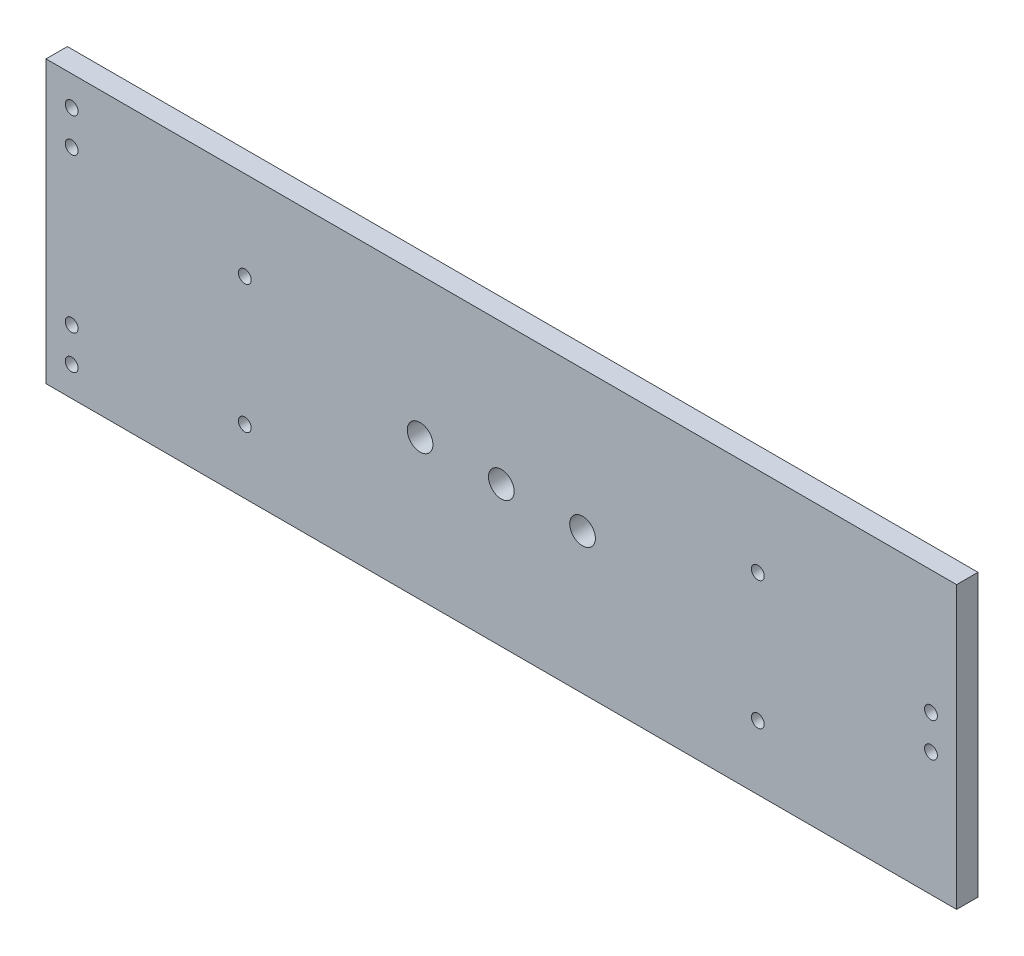
ISO-10303-21;
HEADER;
FILE_DESCRIPTION(('STEP AP214'),'2;1');
FILE_NAME('part.step','',(''),(''),'','','');
FILE_SCHEMA(('AUTOMOTIVE_DESIGN { 1 0 10303 214 1 1 1 1 }'));
ENDSEC;
DATA;
#1=APPLICATION_CONTEXT('core data for automotive mechanical design processes');
#2=APPLICATION_PROTOCOL_DEFINITION('international standard','automotive_design',2000,#1);
#3=PRODUCT_CONTEXT('',#1,'mechanical');
#4=PRODUCT('Part','Part','',(#3));
#5=PRODUCT_RELATED_PRODUCT_CATEGORY('part','',(#4));
#6=PRODUCT_DEFINITION_FORMATION('','',#4);
#7=PRODUCT_DEFINITION_CONTEXT('part definition',#1,'design');
#8=PRODUCT_DEFINITION('design','',#6,#7);
#9=PRODUCT_DEFINITION_SHAPE('','',#8);
#10=(LENGTH_UNIT() NAMED_UNIT(*) SI_UNIT(.MILLI.,.METRE.));
#11=(NAMED_UNIT(*) PLANE_ANGLE_UNIT() SI_UNIT($,.RADIAN.));
#12=(NAMED_UNIT(*) SI_UNIT($,.STERADIAN.) SOLID_ANGLE_UNIT());
#13=UNCERTAINTY_MEASURE_WITH_UNIT(LENGTH_MEASURE(1.E-05),#10,'distance_accuracy_value','');
#14=(GEOMETRIC_REPRESENTATION_CONTEXT(3) GLOBAL_UNCERTAINTY_ASSIGNED_CONTEXT((#13)) GLOBAL_UNIT_ASSIGNED_CONTEXT((#10,
#11,#12)) REPRESENTATION_CONTEXT('',''));
#15=CARTESIAN_POINT('',(0.,0.,0.));
#16=DIRECTION('',(0.,0.,1.));
#17=DIRECTION('',(1.,0.,0.));
#18=AXIS2_PLACEMENT_3D('',#15,#16,#17);
#19=CARTESIAN_POINT('',(0.,0.,5.));
#20=DIRECTION('',(0.,0.,1.));
#21=DIRECTION('',(1.,0.,0.));
#22=AXIS2_PLACEMENT_3D('',#19,#20,#21);
#23=PLANE('',#22);
#24=CARTESIAN_POINT('',(19.,0.,5.));
#25=DIRECTION('',(0.,0.,1.));
#26=DIRECTION('',(1.,0.,0.));
#27=AXIS2_PLACEMENT_3D('',#24,#25,#26);
#28=CIRCLE('',#27,3.);
#29=CARTESIAN_POINT('',(22.,0.,5.));
#30=VERTEX_POINT('',#29);
#31=EDGE_CURVE('E116',#30,#30,#28,.T.);
#32=ORIENTED_EDGE('',*,*,#31,.F.);
#33=EDGE_LOOP('',(#32));
#34=FACE_BOUND('',#33,.T.);
#35=CARTESIAN_POINT('',(-19.,0.,5.));
#36=DIRECTION('',(0.,0.,1.));
#37=DIRECTION('',(1.,0.,0.));
#38=AXIS2_PLACEMENT_3D('',#35,#36,#37);
#39=CIRCLE('',#38,3.);
#40=CARTESIAN_POINT('',(-16.,0.,5.));
#41=VERTEX_POINT('',#40);
#42=EDGE_CURVE('E122',#41,#41,#39,.T.);
#43=ORIENTED_EDGE('',*,*,#42,.F.);
#44=EDGE_LOOP('',(#43));
#45=FACE_BOUND('',#44,.T.);
#46=CARTESIAN_POINT('',(-100.5,26.,5.));
#47=DIRECTION('',(0.,0.,1.));
#48=DIRECTION('',(1.,0.,0.));
#49=AXIS2_PLACEMENT_3D('',#46,#47,#48);
#50=CIRCLE('',#49,1.5);
#51=CARTESIAN_POINT('',(-98.9999999999999,26.,5.));
#52=VERTEX_POINT('',#51);
#53=EDGE_CURVE('E133',#52,#52,#50,.T.);
#54=ORIENTED_EDGE('',*,*,#53,.F.);
#55=EDGE_LOOP('',(#54));
#56=FACE_BOUND('',#55,.T.);
#57=CARTESIAN_POINT('',(-100.5,18.,5.));
#58=DIRECTION('',(0.,0.,1.));
#59=DIRECTION('',(1.,0.,0.));
#60=AXIS2_PLACEMENT_3D('',#57,#58,#59);
#61=CIRCLE('',#60,1.5);
#62=CARTESIAN_POINT('',(-98.9999999999999,18.,5.));
#63=VERTEX_POINT('',#62);
#64=EDGE_CURVE('E139',#63,#63,#61,.T.);
#65=ORIENTED_EDGE('',*,*,#64,.F.);
#66=EDGE_LOOP('',(#65));
#67=FACE_BOUND('',#66,.T.);
#68=CARTESIAN_POINT('',(100.499999999999,-3.99999999999997,5.));
#69=DIRECTION('',(0.,0.,1.));
#70=DIRECTION('',(1.,0.,0.));
#71=AXIS2_PLACEMENT_3D('',#68,#69,#70);
#72=CIRCLE('',#71,1.5);
#73=CARTESIAN_POINT('',(101.999999999999,-3.99999999999997,5.));
#74=VERTEX_POINT('',#73);
#75=EDGE_CURVE('E151',#74,#74,#72,.F.);
#76=ORIENTED_EDGE('',*,*,#75,.T.);
#77=EDGE_LOOP('',(#76));
#78=FACE_BOUND('',#77,.T.);
#79=CARTESIAN_POINT('',(-100.499999999999,-18.,5.));
#80=DIRECTION('',(0.,0.,1.));
#81=DIRECTION('',(1.,0.,0.));
#82=AXIS2_PLACEMENT_3D('',#79,#80,#81);
#83=CIRCLE('',#82,1.5);
#84=CARTESIAN_POINT('',(-98.9999999999995,-18.,5.));
#85=VERTEX_POINT('',#84);
#86=EDGE_CURVE('E157',#85,#85,#83,.T.);
#87=ORIENTED_EDGE('',*,*,#86,.F.);
#88=EDGE_LOOP('',(#87));
#89=FACE_BOUND('',#88,.T.);
#90=CARTESIAN_POINT('',(-100.499999999999,-26.,5.));
#91=DIRECTION('',(0.,0.,1.));
#92=DIRECTION('',(1.,0.,0.));
#93=AXIS2_PLACEMENT_3D('',#90,#91,#92);
#94=CIRCLE('',#93,1.5);
#95=CARTESIAN_POINT('',(-98.9999999999995,-26.,5.));
#96=VERTEX_POINT('',#95);
#97=EDGE_CURVE('E120',#96,#96,#94,.T.);
#98=ORIENTED_EDGE('',*,*,#97,.F.);
#99=EDGE_LOOP('',(#98));
#100=FACE_BOUND('',#99,.T.);
#101=CARTESIAN_POINT('',(-60.,12.1,5.));
#102=DIRECTION('',(0.,0.,1.));
#103=DIRECTION('',(-1.,0.,0.));
#104=AXIS2_PLACEMENT_3D('',#101,#102,#103);
#105=CIRCLE('',#104,1.5);
#106=CARTESIAN_POINT('',(-61.5,12.1,5.));
#107=VERTEX_POINT('',#106);
#108=EDGE_CURVE('E178',#107,#107,#105,.T.);
#109=ORIENTED_EDGE('',*,*,#108,.F.);
#110=EDGE_LOOP('',(#109));
#111=FACE_BOUND('',#110,.T.);
#112=CARTESIAN_POINT('',(-60.,-17.9,5.));
#113=DIRECTION('',(0.,0.,1.));
#114=DIRECTION('',(-1.,0.,0.));
#115=AXIS2_PLACEMENT_3D('',#112,#113,#114);
#116=CIRCLE('',#115,1.5);
#117=CARTESIAN_POINT('',(-61.5,-17.9,5.));
#118=VERTEX_POINT('',#117);
#119=EDGE_CURVE('E172',#118,#118,#116,.T.);
#120=ORIENTED_EDGE('',*,*,#119,.F.);
#121=EDGE_LOOP('',(#120));
#122=FACE_BOUND('',#121,.T.);
#123=CARTESIAN_POINT('',(60.,-17.9,5.));
#124=DIRECTION('',(0.,0.,1.));
#125=DIRECTION('',(1.,0.,0.));
#126=AXIS2_PLACEMENT_3D('',#123,#124,#125);
#127=CIRCLE('',#126,1.5);
#128=CARTESIAN_POINT('',(61.5,-17.9,5.));
#129=VERTEX_POINT('',#128);
#130=EDGE_CURVE('E165',#129,#129,#127,.T.);
#131=ORIENTED_EDGE('',*,*,#130,.F.);
#132=EDGE_LOOP('',(#131));
#133=FACE_BOUND('',#132,.T.);
#134=CARTESIAN_POINT('',(60.,12.1,5.));
#135=DIRECTION('',(0.,0.,1.));
#136=DIRECTION('',(1.,0.,0.));
#137=AXIS2_PLACEMENT_3D('',#134,#135,#136);
#138=CIRCLE('',#137,1.5);
#139=CARTESIAN_POINT('',(61.5,12.1,5.));
#140=VERTEX_POINT('',#139);
#141=EDGE_CURVE('E168',#140,#140,#138,.T.);
#142=ORIENTED_EDGE('',*,*,#141,.F.);
#143=EDGE_LOOP('',(#142));
#144=FACE_BOUND('',#143,.T.);
#145=DIRECTION('',(0.,-1.,0.));
#146=VECTOR('',#145,1.);
#147=CARTESIAN_POINT('',(-106.5,-32.9,5.));
#148=LINE('',#147,#146);
#149=CARTESIAN_POINT('',(-106.5,32.9,5.));
#150=VERTEX_POINT('',#149);
#151=CARTESIAN_POINT('',(-106.5,-32.9,5.));
#152=VERTEX_POINT('',#151);
#153=EDGE_CURVE('E93',#150,#152,#148,.T.);
#154=ORIENTED_EDGE('',*,*,#153,.T.);
#155=DIRECTION('',(1.,0.,0.));
#156=VECTOR('',#155,1.);
#157=CARTESIAN_POINT('',(106.5,-32.9,5.));
#158=LINE('',#157,#156);
#159=CARTESIAN_POINT('',(106.5,-32.9,5.));
#160=VERTEX_POINT('',#159);
#161=EDGE_CURVE('E88',#152,#160,#158,.T.);
#162=ORIENTED_EDGE('',*,*,#161,.T.);
#163=DIRECTION('',(0.,1.,0.));
#164=VECTOR('',#163,1.);
#165=CARTESIAN_POINT('',(106.5,-32.9,5.));
#166=LINE('',#165,#164);
#167=CARTESIAN_POINT('',(106.5,32.9,5.));
#168=VERTEX_POINT('',#167);
#169=EDGE_CURVE('E91',#160,#168,#166,.T.);
#170=ORIENTED_EDGE('',*,*,#169,.T.);
#171=DIRECTION('',(-1.,0.,0.));
#172=VECTOR('',#171,1.);
#173=CARTESIAN_POINT('',(106.5,32.9,5.));
#174=LINE('',#173,#172);
#175=EDGE_CURVE('E58',#168,#150,#174,.T.);
#176=ORIENTED_EDGE('',*,*,#175,.T.);
#177=EDGE_LOOP('',(#154,#162,#170,#176));
#178=FACE_BOUND('',#177,.T.);
#179=CARTESIAN_POINT('',(0.,0.,5.));
#180=DIRECTION('',(0.,0.,1.));
#181=DIRECTION('',(1.,0.,0.));
#182=AXIS2_PLACEMENT_3D('',#179,#180,#181);
#183=CIRCLE('',#182,3.);
#184=CARTESIAN_POINT('',(2.99999999999997,0.,5.));
#185=VERTEX_POINT('',#184);
#186=EDGE_CURVE('E109',#185,#185,#183,.T.);
#187=ORIENTED_EDGE('',*,*,#186,.F.);
#188=EDGE_LOOP('',(#187));
#189=FACE_BOUND('',#188,.T.);
#190=CARTESIAN_POINT('',(100.499999999999,4.00000000000003,5.));
#191=DIRECTION('',(0.,0.,1.));
#192=DIRECTION('',(1.,0.,0.));
#193=AXIS2_PLACEMENT_3D('',#190,#191,#192);
#194=CIRCLE('',#193,1.5);
#195=CARTESIAN_POINT('',(101.999999999999,4.00000000000003,5.));
#196=VERTEX_POINT('',#195);
#197=EDGE_CURVE('E145',#196,#196,#194,.F.);
#198=ORIENTED_EDGE('',*,*,#197,.T.);
#199=EDGE_LOOP('',(#198));
#200=FACE_BOUND('',#199,.T.);
#201=ADVANCED_FACE('F39',(#34,#45,#56,#67,#78,#89,#100,#111,#122,#133,#144,#178,#189,#200),#23,.T.);
#202=CARTESIAN_POINT('',(0.,0.,0.));
#203=DIRECTION('',(0.,0.,1.));
#204=DIRECTION('',(1.,0.,0.));
#205=AXIS2_PLACEMENT_3D('',#202,#203,#204);
#206=PLANE('',#205);
#207=CARTESIAN_POINT('',(19.,0.,0.));
#208=DIRECTION('',(0.,0.,1.));
#209=DIRECTION('',(1.,0.,0.));
#210=AXIS2_PLACEMENT_3D('',#207,#208,#209);
#211=CIRCLE('',#210,3.);
#212=CARTESIAN_POINT('',(22.,0.,0.));
#213=VERTEX_POINT('',#212);
#214=EDGE_CURVE('E43',#213,#213,#211,.T.);
#215=ORIENTED_EDGE('',*,*,#214,.T.);
#216=EDGE_LOOP('',(#215));
#217=FACE_BOUND('',#216,.T.);
#218=CARTESIAN_POINT('',(-19.,0.,0.));
#219=DIRECTION('',(0.,0.,1.));
#220=DIRECTION('',(1.,0.,0.));
#221=AXIS2_PLACEMENT_3D('',#218,#219,#220);
#222=CIRCLE('',#221,3.);
#223=CARTESIAN_POINT('',(-16.,0.,0.));
#224=VERTEX_POINT('',#223);
#225=EDGE_CURVE('E114',#224,#224,#222,.T.);
#226=ORIENTED_EDGE('',*,*,#225,.T.);
#227=EDGE_LOOP('',(#226));
#228=FACE_BOUND('',#227,.T.);
#229=CARTESIAN_POINT('',(-100.5,26.,0.));
#230=DIRECTION('',(0.,0.,1.));
#231=DIRECTION('',(1.,0.,0.));
#232=AXIS2_PLACEMENT_3D('',#229,#230,#231);
#233=CIRCLE('',#232,1.5);
#234=CARTESIAN_POINT('',(-98.9999999999999,26.,0.));
#235=VERTEX_POINT('',#234);
#236=EDGE_CURVE('E129',#235,#235,#233,.T.);
#237=ORIENTED_EDGE('',*,*,#236,.T.);
#238=EDGE_LOOP('',(#237));
#239=FACE_BOUND('',#238,.T.);
#240=CARTESIAN_POINT('',(-100.5,18.,0.));
#241=DIRECTION('',(0.,0.,1.));
#242=DIRECTION('',(1.,0.,0.));
#243=AXIS2_PLACEMENT_3D('',#240,#241,#242);
#244=CIRCLE('',#243,1.5);
#245=CARTESIAN_POINT('',(-98.9999999999999,18.,0.));
#246=VERTEX_POINT('',#245);
#247=EDGE_CURVE('E136',#246,#246,#244,.T.);
#248=ORIENTED_EDGE('',*,*,#247,.T.);
#249=EDGE_LOOP('',(#248));
#250=FACE_BOUND('',#249,.T.);
#251=CARTESIAN_POINT('',(-100.499999999999,-18.,0.));
#252=DIRECTION('',(0.,0.,1.));
#253=DIRECTION('',(1.,0.,0.));
#254=AXIS2_PLACEMENT_3D('',#251,#252,#253);
#255=CIRCLE('',#254,1.5);
#256=CARTESIAN_POINT('',(-98.9999999999995,-18.,0.));
#257=VERTEX_POINT('',#256);
#258=EDGE_CURVE('E154',#257,#257,#255,.T.);
#259=ORIENTED_EDGE('',*,*,#258,.T.);
#260=EDGE_LOOP('',(#259));
#261=FACE_BOUND('',#260,.T.);
#262=CARTESIAN_POINT('',(-100.499999999999,-26.,0.));
#263=DIRECTION('',(0.,0.,1.));
#264=DIRECTION('',(1.,0.,0.));
#265=AXIS2_PLACEMENT_3D('',#262,#263,#264);
#266=CIRCLE('',#265,1.5);
#267=CARTESIAN_POINT('',(-98.9999999999995,-26.,0.));
#268=VERTEX_POINT('',#267);
#269=EDGE_CURVE('E160',#268,#268,#266,.T.);
#270=ORIENTED_EDGE('',*,*,#269,.T.);
#271=EDGE_LOOP('',(#270));
#272=FACE_BOUND('',#271,.T.);
#273=CARTESIAN_POINT('',(-60.,12.1,0.));
#274=DIRECTION('',(0.,0.,1.));
#275=DIRECTION('',(-1.,0.,0.));
#276=AXIS2_PLACEMENT_3D('',#273,#274,#275);
#277=CIRCLE('',#276,1.5);
#278=CARTESIAN_POINT('',(-61.5,12.1,0.));
#279=VERTEX_POINT('',#278);
#280=EDGE_CURVE('E132',#279,#279,#277,.T.);
#281=ORIENTED_EDGE('',*,*,#280,.T.);
#282=EDGE_LOOP('',(#281));
#283=FACE_BOUND('',#282,.T.);
#284=CARTESIAN_POINT('',(-60.,-17.9,0.));
#285=DIRECTION('',(0.,0.,1.));
#286=DIRECTION('',(-1.,0.,0.));
#287=AXIS2_PLACEMENT_3D('',#284,#285,#286);
#288=CIRCLE('',#287,1.5);
#289=CARTESIAN_POINT('',(-61.5,-17.9,0.));
#290=VERTEX_POINT('',#289);
#291=EDGE_CURVE('E175',#290,#290,#288,.T.);
#292=ORIENTED_EDGE('',*,*,#291,.T.);
#293=EDGE_LOOP('',(#292));
#294=FACE_BOUND('',#293,.T.);
#295=CARTESIAN_POINT('',(60.,-17.9,0.));
#296=DIRECTION('',(0.,0.,1.));
#297=DIRECTION('',(1.,0.,0.));
#298=AXIS2_PLACEMENT_3D('',#295,#296,#297);
#299=CIRCLE('',#298,1.5);
#300=CARTESIAN_POINT('',(61.5,-17.9,0.));
#301=VERTEX_POINT('',#300);
#302=EDGE_CURVE('E169',#301,#301,#299,.T.);
#303=ORIENTED_EDGE('',*,*,#302,.T.);
#304=EDGE_LOOP('',(#303));
#305=FACE_BOUND('',#304,.T.);
#306=CARTESIAN_POINT('',(60.,12.1,0.));
#307=DIRECTION('',(0.,0.,1.));
#308=DIRECTION('',(1.,0.,0.));
#309=AXIS2_PLACEMENT_3D('',#306,#307,#308);
#310=CIRCLE('',#309,1.5);
#311=CARTESIAN_POINT('',(61.5,12.1,0.));
#312=VERTEX_POINT('',#311);
#313=EDGE_CURVE('E183',#312,#312,#310,.T.);
#314=ORIENTED_EDGE('',*,*,#313,.T.);
#315=EDGE_LOOP('',(#314));
#316=FACE_BOUND('',#315,.T.);
#317=DIRECTION('',(0.,-1.,0.));
#318=VECTOR('',#317,1.);
#319=CARTESIAN_POINT('',(-106.5,-32.9,0.));
#320=LINE('',#319,#318);
#321=CARTESIAN_POINT('',(-106.5,32.9,0.));
#322=VERTEX_POINT('',#321);
#323=CARTESIAN_POINT('',(-106.5,-32.9,0.));
#324=VERTEX_POINT('',#323);
#325=EDGE_CURVE('E106',#322,#324,#320,.T.);
#326=ORIENTED_EDGE('',*,*,#325,.F.);
#327=DIRECTION('',(-1.,0.,0.));
#328=VECTOR('',#327,1.);
#329=CARTESIAN_POINT('',(106.5,32.9,0.));
#330=LINE('',#329,#328);
#331=CARTESIAN_POINT('',(106.5,32.9,0.));
#332=VERTEX_POINT('',#331);
#333=EDGE_CURVE('E81',#332,#322,#330,.T.);
#334=ORIENTED_EDGE('',*,*,#333,.F.);
#335=DIRECTION('',(0.,1.,0.));
#336=VECTOR('',#335,1.);
#337=CARTESIAN_POINT('',(106.5,-32.9,0.));
#338=LINE('',#337,#336);
#339=CARTESIAN_POINT('',(106.5,-32.9,0.));
#340=VERTEX_POINT('',#339);
#341=EDGE_CURVE('E75',#340,#332,#338,.T.);
#342=ORIENTED_EDGE('',*,*,#341,.F.);
#343=DIRECTION('',(1.,0.,0.));
#344=VECTOR('',#343,1.);
#345=CARTESIAN_POINT('',(106.5,-32.9,0.));
#346=LINE('',#345,#344);
#347=EDGE_CURVE('E97',#324,#340,#346,.T.);
#348=ORIENTED_EDGE('',*,*,#347,.F.);
#349=EDGE_LOOP('',(#326,#334,#342,#348));
#350=FACE_BOUND('',#349,.T.);
#351=CARTESIAN_POINT('',(0.,0.,0.));
#352=DIRECTION('',(0.,0.,1.));
#353=DIRECTION('',(1.,0.,0.));
#354=AXIS2_PLACEMENT_3D('',#351,#352,#353);
#355=CIRCLE('',#354,3.);
#356=CARTESIAN_POINT('',(2.99999999999997,0.,0.));
#357=VERTEX_POINT('',#356);
#358=EDGE_CURVE('E186',#357,#357,#355,.T.);
#359=ORIENTED_EDGE('',*,*,#358,.T.);
#360=EDGE_LOOP('',(#359));
#361=FACE_BOUND('',#360,.T.);
#362=CARTESIAN_POINT('',(100.499999999999,-3.99999999999997,0.));
#363=DIRECTION('',(0.,0.,1.));
#364=DIRECTION('',(1.,0.,0.));
#365=AXIS2_PLACEMENT_3D('',#362,#363,#364);
#366=CIRCLE('',#365,1.5);
#367=CARTESIAN_POINT('',(101.999999999999,-3.99999999999997,0.));
#368=VERTEX_POINT('',#367);
#369=EDGE_CURVE('E148',#368,#368,#366,.F.);
#370=ORIENTED_EDGE('',*,*,#369,.F.);
#371=EDGE_LOOP('',(#370));
#372=FACE_BOUND('',#371,.T.);
#373=CARTESIAN_POINT('',(100.499999999999,4.00000000000003,0.));
#374=DIRECTION('',(0.,0.,1.));
#375=DIRECTION('',(1.,0.,0.));
#376=AXIS2_PLACEMENT_3D('',#373,#374,#375);
#377=CIRCLE('',#376,1.5);
#378=CARTESIAN_POINT('',(101.999999999999,4.00000000000003,0.));
#379=VERTEX_POINT('',#378);
#380=EDGE_CURVE('E142',#379,#379,#377,.F.);
#381=ORIENTED_EDGE('',*,*,#380,.F.);
#382=EDGE_LOOP('',(#381));
#383=FACE_BOUND('',#382,.T.);
#384=ADVANCED_FACE('F194',(#217,#228,#239,#250,#261,#272,#283,#294,#305,#316,#350,#361,#372,
#383),#206,.F.);
#385=CARTESIAN_POINT('',(-106.5,-32.9,5.));
#386=DIRECTION('',(1.,0.,0.));
#387=DIRECTION('',(0.,0.,-1.));
#388=AXIS2_PLACEMENT_3D('',#385,#386,#387);
#389=PLANE('',#388);
#390=ORIENTED_EDGE('',*,*,#325,.T.);
#391=DIRECTION('',(0.,0.,-1.));
#392=VECTOR('',#391,1.);
#393=CARTESIAN_POINT('',(-106.5,-32.9,5.));
#394=LINE('',#393,#392);
#395=EDGE_CURVE('E11',#152,#324,#394,.T.);
#396=ORIENTED_EDGE('',*,*,#395,.F.);
#397=ORIENTED_EDGE('',*,*,#153,.F.);
#398=DIRECTION('',(0.,0.,-1.));
#399=VECTOR('',#398,1.);
#400=CARTESIAN_POINT('',(-106.5,32.9,5.));
#401=LINE('',#400,#399);
#402=EDGE_CURVE('E102',#150,#322,#401,.T.);
#403=ORIENTED_EDGE('',*,*,#402,.T.);
#404=EDGE_LOOP('',(#390,#396,#397,#403));
#405=FACE_BOUND('',#404,.T.);
#406=ADVANCED_FACE('F41',(#405),#389,.F.);
#407=CARTESIAN_POINT('',(106.5,-32.9,5.));
#408=DIRECTION('',(0.,1.,0.));
#409=DIRECTION('',(-1.,0.,0.));
#410=AXIS2_PLACEMENT_3D('',#407,#408,#409);
#411=PLANE('',#410);
#412=ORIENTED_EDGE('',*,*,#347,.T.);
#413=DIRECTION('',(0.,0.,-1.));
#414=VECTOR('',#413,1.);
#415=CARTESIAN_POINT('',(106.5,-32.9,5.));
#416=LINE('',#415,#414);
#417=EDGE_CURVE('E49',#160,#340,#416,.T.);
#418=ORIENTED_EDGE('',*,*,#417,.F.);
#419=ORIENTED_EDGE('',*,*,#161,.F.);
#420=ORIENTED_EDGE('',*,*,#395,.T.);
#421=EDGE_LOOP('',(#412,#418,#419,#420));
#422=FACE_BOUND('',#421,.T.);
#423=ADVANCED_FACE('F96',(#422),#411,.F.);
#424=CARTESIAN_POINT('',(106.5,-32.9,5.));
#425=DIRECTION('',(-1.,0.,0.));
#426=DIRECTION('',(0.,0.,1.));
#427=AXIS2_PLACEMENT_3D('',#424,#425,#426);
#428=PLANE('',#427);
#429=ORIENTED_EDGE('',*,*,#341,.T.);
#430=DIRECTION('',(0.,0.,-1.));
#431=VECTOR('',#430,1.);
#432=CARTESIAN_POINT('',(106.5,32.9,5.));
#433=LINE('',#432,#431);
#434=EDGE_CURVE('E98',#168,#332,#433,.T.);
#435=ORIENTED_EDGE('',*,*,#434,.F.);
#436=ORIENTED_EDGE('',*,*,#169,.F.);
#437=ORIENTED_EDGE('',*,*,#417,.T.);
#438=EDGE_LOOP('',(#429,#435,#436,#437));
#439=FACE_BOUND('',#438,.T.);
#440=ADVANCED_FACE('F100',(#439),#428,.F.);
#441=CARTESIAN_POINT('',(106.5,32.9,5.));
#442=DIRECTION('',(0.,-1.,0.));
#443=DIRECTION('',(1.,0.,0.));
#444=AXIS2_PLACEMENT_3D('',#441,#442,#443);
#445=PLANE('',#444);
#446=ORIENTED_EDGE('',*,*,#333,.T.);
#447=ORIENTED_EDGE('',*,*,#402,.F.);
#448=ORIENTED_EDGE('',*,*,#175,.F.);
#449=ORIENTED_EDGE('',*,*,#434,.T.);
#450=EDGE_LOOP('',(#446,#447,#448,#449));
#451=FACE_BOUND('',#450,.T.);
#452=ADVANCED_FACE('F200',(#451),#445,.F.);
#453=CARTESIAN_POINT('',(0.,0.,5.));
#454=DIRECTION('',(0.,0.,-1.));
#455=DIRECTION('',(-1.,0.,0.));
#456=AXIS2_PLACEMENT_3D('',#453,#454,#455);
#457=CYLINDRICAL_SURFACE('',#456,3.);
#458=ORIENTED_EDGE('',*,*,#186,.T.);
#459=EDGE_LOOP('',(#458));
#460=FACE_BOUND('',#459,.T.);
#461=ORIENTED_EDGE('',*,*,#358,.F.);
#462=EDGE_LOOP('',(#461));
#463=FACE_BOUND('',#462,.T.);
#464=ADVANCED_FACE('F197',(#460,#463),#457,.F.);
#465=CARTESIAN_POINT('',(60.,12.1,0.));
#466=DIRECTION('',(0.,0.,1.));
#467=DIRECTION('',(1.,0.,0.));
#468=AXIS2_PLACEMENT_3D('',#465,#466,#467);
#469=CYLINDRICAL_SURFACE('',#468,1.5);
#470=ORIENTED_EDGE('',*,*,#313,.F.);
#471=EDGE_LOOP('',(#470));
#472=FACE_BOUND('',#471,.T.);
#473=ORIENTED_EDGE('',*,*,#141,.T.);
#474=EDGE_LOOP('',(#473));
#475=FACE_BOUND('',#474,.T.);
#476=ADVANCED_FACE('F199',(#472,#475),#469,.F.);
#477=CARTESIAN_POINT('',(60.,-17.9,0.));
#478=DIRECTION('',(0.,0.,1.));
#479=DIRECTION('',(1.,0.,0.));
#480=AXIS2_PLACEMENT_3D('',#477,#478,#479);
#481=CYLINDRICAL_SURFACE('',#480,1.5);
#482=ORIENTED_EDGE('',*,*,#302,.F.);
#483=EDGE_LOOP('',(#482));
#484=FACE_BOUND('',#483,.T.);
#485=ORIENTED_EDGE('',*,*,#130,.T.);
#486=EDGE_LOOP('',(#485));
#487=FACE_BOUND('',#486,.T.);
#488=ADVANCED_FACE('F207',(#484,#487),#481,.F.);
#489=CARTESIAN_POINT('',(-60.,-17.9,0.));
#490=DIRECTION('',(0.,0.,1.));
#491=DIRECTION('',(1.,0.,0.));
#492=AXIS2_PLACEMENT_3D('',#489,#490,#491);
#493=CYLINDRICAL_SURFACE('',#492,1.5);
#494=ORIENTED_EDGE('',*,*,#291,.F.);
#495=EDGE_LOOP('',(#494));
#496=FACE_BOUND('',#495,.T.);
#497=ORIENTED_EDGE('',*,*,#119,.T.);
#498=EDGE_LOOP('',(#497));
#499=FACE_BOUND('',#498,.T.);
#500=ADVANCED_FACE('F268',(#496,#499),#493,.F.);
#501=CARTESIAN_POINT('',(-60.,12.1,0.));
#502=DIRECTION('',(0.,0.,1.));
#503=DIRECTION('',(1.,0.,0.));
#504=AXIS2_PLACEMENT_3D('',#501,#502,#503);
#505=CYLINDRICAL_SURFACE('',#504,1.5);
#506=ORIENTED_EDGE('',*,*,#280,.F.);
#507=EDGE_LOOP('',(#506));
#508=FACE_BOUND('',#507,.T.);
#509=ORIENTED_EDGE('',*,*,#108,.T.);
#510=EDGE_LOOP('',(#509));
#511=FACE_BOUND('',#510,.T.);
#512=ADVANCED_FACE('F278',(#508,#511),#505,.F.);
#513=CARTESIAN_POINT('',(-100.499999999999,-26.,0.));
#514=DIRECTION('',(0.,0.,1.));
#515=DIRECTION('',(1.,0.,0.));
#516=AXIS2_PLACEMENT_3D('',#513,#514,#515);
#517=CYLINDRICAL_SURFACE('',#516,1.5);
#518=ORIENTED_EDGE('',*,*,#269,.F.);
#519=EDGE_LOOP('',(#518));
#520=FACE_BOUND('',#519,.T.);
#521=ORIENTED_EDGE('',*,*,#97,.T.);
#522=EDGE_LOOP('',(#521));
#523=FACE_BOUND('',#522,.T.);
#524=ADVANCED_FACE('F288',(#520,#523),#517,.F.);
#525=CARTESIAN_POINT('',(-100.499999999999,-18.,0.));
#526=DIRECTION('',(0.,0.,1.));
#527=DIRECTION('',(1.,0.,0.));
#528=AXIS2_PLACEMENT_3D('',#525,#526,#527);
#529=CYLINDRICAL_SURFACE('',#528,1.5);
#530=ORIENTED_EDGE('',*,*,#258,.F.);
#531=EDGE_LOOP('',(#530));
#532=FACE_BOUND('',#531,.T.);
#533=ORIENTED_EDGE('',*,*,#86,.T.);
#534=EDGE_LOOP('',(#533));
#535=FACE_BOUND('',#534,.T.);
#536=ADVANCED_FACE('F309',(#532,#535),#529,.F.);
#537=CARTESIAN_POINT('',(100.499999999999,-3.99999999999997,0.));
#538=DIRECTION('',(0.,0.,1.));
#539=DIRECTION('',(1.,0.,0.));
#540=AXIS2_PLACEMENT_3D('',#537,#538,#539);
#541=CYLINDRICAL_SURFACE('',#540,1.5);
#542=ORIENTED_EDGE('',*,*,#369,.T.);
#543=EDGE_LOOP('',(#542));
#544=FACE_BOUND('',#543,.T.);
#545=ORIENTED_EDGE('',*,*,#75,.F.);
#546=EDGE_LOOP('',(#545));
#547=FACE_BOUND('',#546,.T.);
#548=ADVANCED_FACE('F319',(#544,#547),#541,.F.);
#549=CARTESIAN_POINT('',(100.499999999999,4.00000000000003,0.));
#550=DIRECTION('',(0.,0.,1.));
#551=DIRECTION('',(1.,0.,0.));
#552=AXIS2_PLACEMENT_3D('',#549,#550,#551);
#553=CYLINDRICAL_SURFACE('',#552,1.5);
#554=ORIENTED_EDGE('',*,*,#380,.T.);
#555=EDGE_LOOP('',(#554));
#556=FACE_BOUND('',#555,.T.);
#557=ORIENTED_EDGE('',*,*,#197,.F.);
#558=EDGE_LOOP('',(#557));
#559=FACE_BOUND('',#558,.T.);
#560=ADVANCED_FACE('F329',(#556,#559),#553,.F.);
#561=CARTESIAN_POINT('',(-100.5,18.,0.));
#562=DIRECTION('',(0.,0.,1.));
#563=DIRECTION('',(1.,0.,0.));
#564=AXIS2_PLACEMENT_3D('',#561,#562,#563);
#565=CYLINDRICAL_SURFACE('',#564,1.5);
#566=ORIENTED_EDGE('',*,*,#247,.F.);
#567=EDGE_LOOP('',(#566));
#568=FACE_BOUND('',#567,.T.);
#569=ORIENTED_EDGE('',*,*,#64,.T.);
#570=EDGE_LOOP('',(#569));
#571=FACE_BOUND('',#570,.T.);
#572=ADVANCED_FACE('F339',(#568,#571),#565,.F.);
#573=CARTESIAN_POINT('',(-100.5,26.,0.));
#574=DIRECTION('',(0.,0.,1.));
#575=DIRECTION('',(1.,0.,0.));
#576=AXIS2_PLACEMENT_3D('',#573,#574,#575);
#577=CYLINDRICAL_SURFACE('',#576,1.5);
#578=ORIENTED_EDGE('',*,*,#236,.F.);
#579=EDGE_LOOP('',(#578));
#580=FACE_BOUND('',#579,.T.);
#581=ORIENTED_EDGE('',*,*,#53,.T.);
#582=EDGE_LOOP('',(#581));
#583=FACE_BOUND('',#582,.T.);
#584=ADVANCED_FACE('F349',(#580,#583),#577,.F.);
#585=CARTESIAN_POINT('',(-19.,0.,-5.));
#586=DIRECTION('',(0.,0.,1.));
#587=DIRECTION('',(1.,0.,0.));
#588=AXIS2_PLACEMENT_3D('',#585,#586,#587);
#589=CYLINDRICAL_SURFACE('',#588,3.);
#590=ORIENTED_EDGE('',*,*,#42,.T.);
#591=EDGE_LOOP('',(#590));
#592=FACE_BOUND('',#591,.T.);
#593=ORIENTED_EDGE('',*,*,#225,.F.);
#594=EDGE_LOOP('',(#593));
#595=FACE_BOUND('',#594,.T.);
#596=ADVANCED_FACE('F358',(#592,#595),#589,.F.);
#597=CARTESIAN_POINT('',(19.,0.,-5.));
#598=DIRECTION('',(0.,0.,1.));
#599=DIRECTION('',(1.,0.,0.));
#600=AXIS2_PLACEMENT_3D('',#597,#598,#599);
#601=CYLINDRICAL_SURFACE('',#600,3.);
#602=ORIENTED_EDGE('',*,*,#31,.T.);
#603=EDGE_LOOP('',(#602));
#604=FACE_BOUND('',#603,.T.);
#605=ORIENTED_EDGE('',*,*,#214,.F.);
#606=EDGE_LOOP('',(#605));
#607=FACE_BOUND('',#606,.T.);
#608=ADVANCED_FACE('F367',(#604,#607),#601,.F.);
#609=CLOSED_SHELL('',(#201,#384,#406,#423,#440,#452,#464,#476,#488,#500,#512,#524,#536,#548,
#560,#572,#584,#596,#608));
#610=MANIFOLD_SOLID_BREP('B2',#609);
#611=ADVANCED_BREP_SHAPE_REPRESENTATION('',(#18,#610),#14);
#612=SHAPE_DEFINITION_REPRESENTATION(#9,#611);
ENDSEC;
END-ISO-10303-21;
